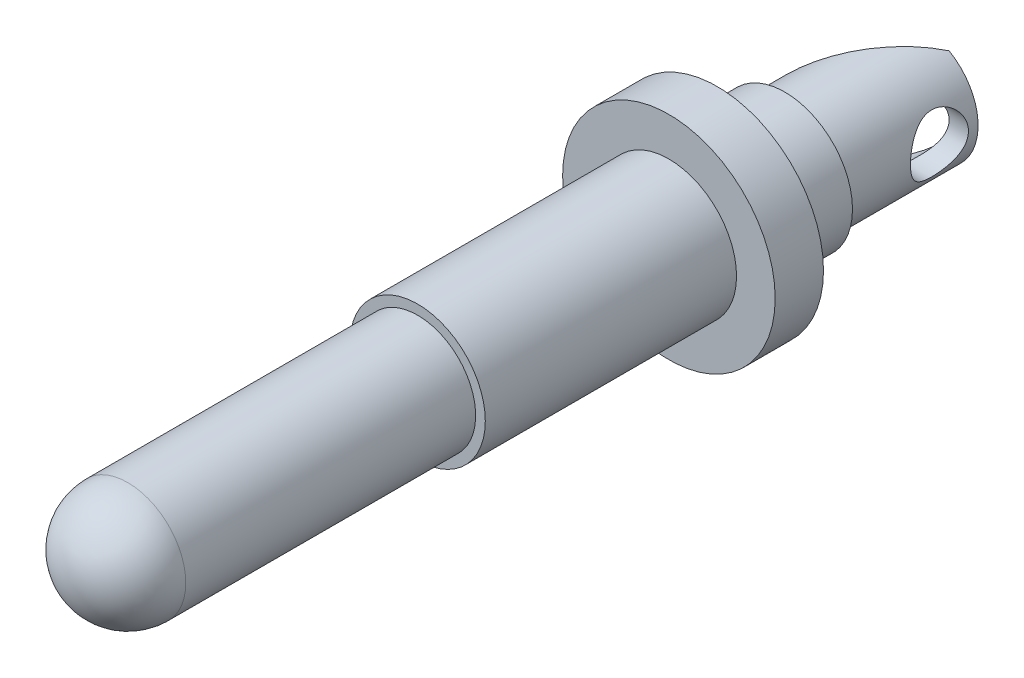
ISO-10303-21;
HEADER;
FILE_DESCRIPTION(('STEP AP214'),'2;1');
FILE_NAME('part.step','',(''),(''),'','','');
FILE_SCHEMA(('AUTOMOTIVE_DESIGN { 1 0 10303 214 1 1 1 1 }'));
ENDSEC;
DATA;
#1=APPLICATION_CONTEXT('core data for automotive mechanical design processes');
#2=APPLICATION_PROTOCOL_DEFINITION('international standard','automotive_design',2000,#1);
#3=PRODUCT_CONTEXT('',#1,'mechanical');
#4=PRODUCT('Part','Part','',(#3));
#5=PRODUCT_RELATED_PRODUCT_CATEGORY('part','',(#4));
#6=PRODUCT_DEFINITION_FORMATION('','',#4);
#7=PRODUCT_DEFINITION_CONTEXT('part definition',#1,'design');
#8=PRODUCT_DEFINITION('design','',#6,#7);
#9=PRODUCT_DEFINITION_SHAPE('','',#8);
#10=(LENGTH_UNIT() NAMED_UNIT(*) SI_UNIT(.MILLI.,.METRE.));
#11=(NAMED_UNIT(*) PLANE_ANGLE_UNIT() SI_UNIT($,.RADIAN.));
#12=(NAMED_UNIT(*) SI_UNIT($,.STERADIAN.) SOLID_ANGLE_UNIT());
#13=UNCERTAINTY_MEASURE_WITH_UNIT(LENGTH_MEASURE(1.E-05),#10,'distance_accuracy_value','');
#14=(GEOMETRIC_REPRESENTATION_CONTEXT(3) GLOBAL_UNCERTAINTY_ASSIGNED_CONTEXT((#13)) GLOBAL_UNIT_ASSIGNED_CONTEXT((#10,
#11,#12)) REPRESENTATION_CONTEXT('',''));
#15=CARTESIAN_POINT('',(0.,0.,0.));
#16=DIRECTION('',(0.,0.,1.));
#17=DIRECTION('',(1.,0.,0.));
#18=AXIS2_PLACEMENT_3D('',#15,#16,#17);
#19=CARTESIAN_POINT('',(0.,0.,-26.));
#20=DIRECTION('',(0.,0.,1.));
#21=DIRECTION('',(1.,0.,0.));
#22=AXIS2_PLACEMENT_3D('',#19,#20,#21);
#23=CYLINDRICAL_SURFACE('',#22,3.5);
#24=CARTESIAN_POINT('',(0.,0.,-19.));
#25=DIRECTION('',(0.,0.,-1.));
#26=DIRECTION('',(-1.,0.,0.));
#27=AXIS2_PLACEMENT_3D('',#24,#25,#26);
#28=CIRCLE('',#27,3.5);
#29=CARTESIAN_POINT('',(3.5,0.,-19.));
#30=VERTEX_POINT('',#29);
#31=EDGE_CURVE('E81',#30,#30,#28,.T.);
#32=CARTESIAN_POINT('',(0.,0.,-15.5));
#33=DIRECTION('',(0.,0.,1.));
#34=DIRECTION('',(1.,0.,0.));
#35=AXIS2_PLACEMENT_3D('',#32,#33,#34);
#36=CIRCLE('',#35,3.5);
#37=CARTESIAN_POINT('',(3.5,0.,-15.5));
#38=VERTEX_POINT('',#37);
#39=EDGE_CURVE('E42',#38,#38,#36,.T.);
#40=CARTESIAN_POINT('',(3.5,0.,-19.));
#41=CARTESIAN_POINT('',(3.5,0.,-18.9635416666667));
#42=CARTESIAN_POINT('',(3.5,0.,-18.9270833333333));
#43=CARTESIAN_POINT('',(3.5,0.,-18.8541666666667));
#44=CARTESIAN_POINT('',(3.5,0.,-18.8177083333333));
#45=CARTESIAN_POINT('',(3.5,0.,-18.7447916666667));
#46=CARTESIAN_POINT('',(3.5,0.,-18.7083333333333));
#47=CARTESIAN_POINT('',(3.5,0.,-18.6354166666667));
#48=CARTESIAN_POINT('',(3.5,0.,-18.5989583333333));
#49=CARTESIAN_POINT('',(3.5,0.,-18.5260416666667));
#50=CARTESIAN_POINT('',(3.5,0.,-18.4895833333333));
#51=CARTESIAN_POINT('',(3.5,0.,-18.4166666666667));
#52=CARTESIAN_POINT('',(3.5,0.,-18.3802083333333));
#53=CARTESIAN_POINT('',(3.5,0.,-18.3072916666667));
#54=CARTESIAN_POINT('',(3.5,0.,-18.2708333333333));
#55=CARTESIAN_POINT('',(3.5,0.,-18.1979166666667));
#56=CARTESIAN_POINT('',(3.5,0.,-18.1614583333333));
#57=CARTESIAN_POINT('',(3.5,0.,-18.0885416666667));
#58=CARTESIAN_POINT('',(3.5,0.,-18.0520833333333));
#59=CARTESIAN_POINT('',(3.5,0.,-17.9791666666667));
#60=CARTESIAN_POINT('',(3.5,0.,-17.9427083333333));
#61=CARTESIAN_POINT('',(3.5,0.,-17.8697916666667));
#62=CARTESIAN_POINT('',(3.5,0.,-17.8333333333333));
#63=CARTESIAN_POINT('',(3.5,0.,-17.7604166666667));
#64=CARTESIAN_POINT('',(3.5,0.,-17.7239583333333));
#65=CARTESIAN_POINT('',(3.5,0.,-17.6510416666667));
#66=CARTESIAN_POINT('',(3.5,0.,-17.6145833333333));
#67=CARTESIAN_POINT('',(3.5,0.,-17.5416666666667));
#68=CARTESIAN_POINT('',(3.5,0.,-17.5052083333333));
#69=CARTESIAN_POINT('',(3.5,0.,-17.4322916666667));
#70=CARTESIAN_POINT('',(3.5,0.,-17.3958333333333));
#71=CARTESIAN_POINT('',(3.5,0.,-17.3229166666667));
#72=CARTESIAN_POINT('',(3.5,0.,-17.2864583333333));
#73=CARTESIAN_POINT('',(3.5,0.,-17.2135416666667));
#74=CARTESIAN_POINT('',(3.5,0.,-17.1770833333333));
#75=CARTESIAN_POINT('',(3.5,0.,-17.1041666666667));
#76=CARTESIAN_POINT('',(3.5,0.,-17.0677083333333));
#77=CARTESIAN_POINT('',(3.5,0.,-16.9947916666667));
#78=CARTESIAN_POINT('',(3.5,0.,-16.9583333333333));
#79=CARTESIAN_POINT('',(3.5,0.,-16.8854166666667));
#80=CARTESIAN_POINT('',(3.5,0.,-16.8489583333333));
#81=CARTESIAN_POINT('',(3.5,0.,-16.7760416666667));
#82=CARTESIAN_POINT('',(3.5,0.,-16.7395833333333));
#83=CARTESIAN_POINT('',(3.5,0.,-16.6666666666667));
#84=CARTESIAN_POINT('',(3.5,0.,-16.6302083333333));
#85=CARTESIAN_POINT('',(3.5,0.,-16.5572916666667));
#86=CARTESIAN_POINT('',(3.5,0.,-16.5208333333333));
#87=CARTESIAN_POINT('',(3.5,0.,-16.4479166666667));
#88=CARTESIAN_POINT('',(3.5,0.,-16.4114583333333));
#89=CARTESIAN_POINT('',(3.5,0.,-16.3385416666667));
#90=CARTESIAN_POINT('',(3.5,0.,-16.3020833333333));
#91=CARTESIAN_POINT('',(3.5,0.,-16.2291666666667));
#92=CARTESIAN_POINT('',(3.5,0.,-16.1927083333333));
#93=CARTESIAN_POINT('',(3.5,0.,-16.1197916666667));
#94=CARTESIAN_POINT('',(3.5,0.,-16.0833333333333));
#95=CARTESIAN_POINT('',(3.5,0.,-16.0104166666667));
#96=CARTESIAN_POINT('',(3.5,0.,-15.9739583333333));
#97=CARTESIAN_POINT('',(3.5,0.,-15.9010416666667));
#98=CARTESIAN_POINT('',(3.5,0.,-15.8645833333333));
#99=CARTESIAN_POINT('',(3.5,0.,-15.7916666666667));
#100=CARTESIAN_POINT('',(3.5,0.,-15.7552083333333));
#101=CARTESIAN_POINT('',(3.5,0.,-15.6822916666667));
#102=CARTESIAN_POINT('',(3.5,0.,-15.6458333333333));
#103=CARTESIAN_POINT('',(3.5,0.,-15.5729166666667));
#104=CARTESIAN_POINT('',(3.5,0.,-15.5364583333333));
#105=CARTESIAN_POINT('',(3.5,0.,-15.5));
#106=B_SPLINE_CURVE_WITH_KNOTS('',3,(#40,#41,#42,#43,#44,#45,#46,#47,#48,#49,#50,#51,#52,#53,
#54,#55,#56,#57,#58,#59,#60,#61,#62,#63,#64,#65,#66,#67,#68,#69,#70,#71,#72,#73,#74,#75,#76,#77,
#78,#79,#80,#81,#82,#83,#84,#85,#86,#87,#88,#89,#90,#91,#92,#93,#94,#95,#96,#97,#98,#99,#100,
#101,#102,#103,#104,#105),.UNSPECIFIED.,.F.,.F.,(4,2,2,2,2,2,2,2,2,2,2,2,2,2,2,2,2,2,2,2,2,2,2,
2,2,2,2,2,2,2,2,2,4),(0.,0.109375000000002,0.21875,0.328125000000002,0.4375,0.546874999999999,
0.656250000000001,0.765625000000002,0.874999999999997,0.984374999999999,1.09375,1.203125,1.3125,
1.421875,1.53125,1.640625,1.75,1.859375,1.96875,2.078125,2.1875,2.296875,2.40625,2.515625,2.625,
2.734375,2.84375,2.953125,3.0625,3.171875,3.28125,3.390625,3.5),.UNSPECIFIED.);
#107=EDGE_CURVE('BSEAM34',#30,#38,#106,.T.);
#108=ORIENTED_EDGE('',*,*,#31,.F.);
#109=ORIENTED_EDGE('',*,*,#39,.F.);
#110=ORIENTED_EDGE('',*,*,#107,.T.);
#111=ORIENTED_EDGE('',*,*,#107,.F.);
#112=EDGE_LOOP('',(#108,#110,#109,#111));
#113=FACE_BOUND('',#112,.T.);
#114=ADVANCED_FACE('F34',(#113),#23,.T.);
#115=CARTESIAN_POINT('',(0.,0.,-19.));
#116=DIRECTION('',(0.,0.,-1.));
#117=DIRECTION('',(-1.,0.,0.));
#118=AXIS2_PLACEMENT_3D('',#115,#116,#117);
#119=PLANE('',#118);
#120=CARTESIAN_POINT('',(0.,0.,-19.));
#121=DIRECTION('',(0.,0.,-1.));
#122=DIRECTION('',(-1.,0.,0.));
#123=AXIS2_PLACEMENT_3D('',#120,#121,#122);
#124=CIRCLE('',#123,3.);
#125=CARTESIAN_POINT('',(-3.,0.,-19.));
#126=VERTEX_POINT('',#125);
#127=EDGE_CURVE('E77',#126,#126,#124,.T.);
#128=ORIENTED_EDGE('',*,*,#127,.F.);
#129=EDGE_LOOP('',(#128));
#130=FACE_BOUND('',#129,.T.);
#131=ORIENTED_EDGE('',*,*,#31,.T.);
#132=EDGE_LOOP('',(#131));
#133=FACE_BOUND('',#132,.T.);
#134=ADVANCED_FACE('F151',(#130,#133),#119,.T.);
#135=CARTESIAN_POINT('',(0.,0.,-19.));
#136=DIRECTION('',(0.,0.,-1.));
#137=DIRECTION('',(-1.,0.,0.));
#138=AXIS2_PLACEMENT_3D('',#135,#136,#137);
#139=CYLINDRICAL_SURFACE('',#138,3.);
#140=CARTESIAN_POINT('',(0.,0.,-24.));
#141=DIRECTION('',(0.8,0.,0.6));
#142=DIRECTION('',(0.6,0.,-0.8));
#143=AXIS2_PLACEMENT_3D('',#140,#141,#142);
#144=ELLIPSE('',#143,5.,3.);
#145=CARTESIAN_POINT('',(1.5,-2.59807621135332,-26.));
#146=VERTEX_POINT('',#145);
#147=CARTESIAN_POINT('',(1.5,2.59807621135332,-26.));
#148=VERTEX_POINT('',#147);
#149=EDGE_CURVE('E63',#146,#148,#144,.F.);
#150=ORIENTED_EDGE('',*,*,#149,.F.);
#151=CARTESIAN_POINT('',(0.,0.,-26.));
#152=DIRECTION('',(0.,0.,-1.));
#153=DIRECTION('',(-1.,0.,0.));
#154=AXIS2_PLACEMENT_3D('',#151,#152,#153);
#155=CIRCLE('',#154,3.);
#156=EDGE_CURVE('E73',#148,#146,#155,.T.);
#157=ORIENTED_EDGE('',*,*,#156,.F.);
#158=EDGE_LOOP('',(#150,#157));
#159=FACE_BOUND('',#158,.T.);
#160=CARTESIAN_POINT('',(3.,0.,-22.5));
#161=CARTESIAN_POINT('',(2.99999570107562,-0.0788579444268496,-22.5000049534758));
#162=CARTESIAN_POINT('',(2.99685736529635,-0.157809899546343,-22.5062551096816));
#163=CARTESIAN_POINT('',(2.98461234055736,-0.313380352903342,-22.5309793205123));
#164=CARTESIAN_POINT('',(2.97549431743379,-0.389994130070442,-22.5494765894967));
#165=CARTESIAN_POINT('',(2.95224419105063,-0.538400317320669,-22.597790712925));
#166=CARTESIAN_POINT('',(2.93813158766306,-0.610210204408714,-22.627563576372));
#167=CARTESIAN_POINT('',(2.90618664773642,-0.747708925209891,-22.6973559320475));
#168=CARTESIAN_POINT('',(2.88835460450288,-0.813398240985082,-22.7373746163733));
#169=CARTESIAN_POINT('',(2.84934387387093,-0.941261726642856,-22.8292758742279));
#170=CARTESIAN_POINT('',(2.82802798691306,-1.00298281668316,-22.8817297188595));
#171=CARTESIAN_POINT('',(2.78489955370115,-1.11716916730046,-22.9957822188706));
#172=CARTESIAN_POINT('',(2.76308664313552,-1.16962737466014,-23.0573877776587));
#173=CARTESIAN_POINT('',(2.71948426796022,-1.26787800067541,-23.1937250242851));
#174=CARTESIAN_POINT('',(2.69782780455198,-1.31283800332745,-23.2691041475189));
#175=CARTESIAN_POINT('',(2.65928968158481,-1.38925234033603,-23.4275510039793));
#176=CARTESIAN_POINT('',(2.64240461410485,-1.42071632244949,-23.5106131930841));
#177=CARTESIAN_POINT('',(2.61686800556713,-1.46719866328287,-23.6769976581329));
#178=CARTESIAN_POINT('',(2.60778407375571,-1.48308878562065,-23.7600066781011));
#179=CARTESIAN_POINT('',(2.59772834922792,-1.50064048996326,-23.9279682566692));
#180=CARTESIAN_POINT('',(2.59674854014933,-1.5023161325596,-24.0129188113067));
#181=CARTESIAN_POINT('',(2.60266395385873,-1.49203093075843,-24.1714290364731));
#182=CARTESIAN_POINT('',(2.60863145493021,-1.48167683930522,-24.2451360468346));
#183=CARTESIAN_POINT('',(2.62614343100776,-1.45040977358539,-24.3895828640596));
#184=CARTESIAN_POINT('',(2.63768968247665,-1.42949343584647,-24.460321717958));
#185=CARTESIAN_POINT('',(2.66531214619112,-1.37731467057899,-24.5988436988485));
#186=CARTESIAN_POINT('',(2.68148760995998,-1.34582260067398,-24.6665195981787));
#187=CARTESIAN_POINT('',(2.71655106422106,-1.27356253150199,-24.795951438885));
#188=CARTESIAN_POINT('',(2.73544027170286,-1.23279036571869,-24.8577047034001));
#189=CARTESIAN_POINT('',(2.77669736854929,-1.13709908236917,-24.9817818791148));
#190=CARTESIAN_POINT('',(2.7992026535512,-1.08104168755391,-25.0431853103642));
#191=CARTESIAN_POINT('',(2.84321434950611,-0.95933336811205,-25.1561031278863));
#192=CARTESIAN_POINT('',(2.86472027938202,-0.893677884861418,-25.2076127880508));
#193=CARTESIAN_POINT('',(2.90552980924446,-0.750774758747763,-25.3015284915446));
#194=CARTESIAN_POINT('',(2.92468476243011,-0.673130387399105,-25.3434007086686));
#195=CARTESIAN_POINT('',(2.95736821681864,-0.510699323233188,-25.4131455435645));
#196=CARTESIAN_POINT('',(2.9709011841533,-0.425918364397907,-25.4410292775227));
#197=CARTESIAN_POINT('',(2.98986500612153,-0.259149737491048,-25.479713105575));
#198=CARTESIAN_POINT('',(2.99587407451965,-0.177512295822485,-25.4917368536202));
#199=CARTESIAN_POINT('',(3.00109520188655,-0.0131693999240255,-25.5021970967017));
#200=CARTESIAN_POINT('',(3.00031048081978,0.0695355298048641,-25.5006400284592));
#201=CARTESIAN_POINT('',(2.99236788380152,0.22684945797898,-25.4846899673719));
#202=CARTESIAN_POINT('',(2.98570868532253,0.301589112074895,-25.471301200905));
#203=CARTESIAN_POINT('',(2.9673325697226,0.447610338452911,-25.4336428921573));
#204=CARTESIAN_POINT('',(2.95561509501618,0.518891528536629,-25.4093721503198));
#205=CARTESIAN_POINT('',(2.92776377120382,0.658332912674356,-25.3500023003504));
#206=CARTESIAN_POINT('',(2.91151322654446,0.726345595508702,-25.3146134248256));
#207=CARTESIAN_POINT('',(2.87615961476127,0.855692042548903,-25.2343386965301));
#208=CARTESIAN_POINT('',(2.85705533350408,0.917022944664883,-25.1894487981069));
#209=CARTESIAN_POINT('',(2.81562332004297,1.03765153393382,-25.0863593620039));
#210=CARTESIAN_POINT('',(2.79316327265249,1.09615811672853,-25.0272856973323));
#211=CARTESIAN_POINT('',(2.7489358741323,1.20278448167828,-24.9001122730834));
#212=CARTESIAN_POINT('',(2.72716901100071,1.2508970785678,-24.8320063217281));
#213=CARTESIAN_POINT('',(2.68576788309735,1.33756187171852,-24.6845345187405));
#214=CARTESIAN_POINT('',(2.66628794383592,1.37553824370036,-24.6047831008583));
#215=CARTESIAN_POINT('',(2.63361108441203,1.43712423890204,-24.4387348986375));
#216=CARTESIAN_POINT('',(2.62040607332626,1.46075237380051,-24.3524467102997));
#217=CARTESIAN_POINT('',(2.60342251538704,1.4907925312003,-24.1846346656729));
#218=CARTESIAN_POINT('',(2.59886075197598,1.49863949460817,-24.1034486198471));
#219=CARTESIAN_POINT('',(2.59748031962406,1.50103373156429,-23.9408293992532));
#220=CARTESIAN_POINT('',(2.60065829439586,1.49558676993485,-23.8593963468932));
#221=CARTESIAN_POINT('',(2.61356793076616,1.47288918838995,-23.7067747476998));
#222=CARTESIAN_POINT('',(2.62264641723988,1.45681247151454,-23.6353492947829));
#223=CARTESIAN_POINT('',(2.6455652428148,1.41476303733661,-23.4962878208635));
#224=CARTESIAN_POINT('',(2.65940711354503,1.38878713673987,-23.428653026862));
#225=CARTESIAN_POINT('',(2.69142795546804,1.32572361795083,-23.2940627235202));
#226=CARTESIAN_POINT('',(2.70983583593882,1.28800670672354,-23.2274581472565));
#227=CARTESIAN_POINT('',(2.74852997452291,1.20322645745608,-23.1010881957281));
#228=CARTESIAN_POINT('',(2.76881720693417,1.15615825686233,-23.0413264042183));
#229=CARTESIAN_POINT('',(2.81193484737139,1.04730498999205,-22.922787026468));
#230=CARTESIAN_POINT('',(2.83477474959943,0.98442663449588,-22.8650113464746));
#231=CARTESIAN_POINT('',(2.87816628389896,0.849232209349785,-22.7606055248471));
#232=CARTESIAN_POINT('',(2.89871667939293,0.776911084957785,-22.7139813907951));
#233=CARTESIAN_POINT('',(2.93547014349806,0.623897395174408,-22.6331454559319));
#234=CARTESIAN_POINT('',(2.951641447409,0.543149255665086,-22.5990237461453));
#235=CARTESIAN_POINT('',(2.9775201194848,0.376113151707122,-22.5452877483639));
#236=CARTESIAN_POINT('',(2.98724585044602,0.289841699383643,-22.5256322297914));
#237=CARTESIAN_POINT('',(2.99543192870217,0.168902919736338,-22.5091538833714));
#238=CARTESIAN_POINT('',(2.99714048010376,0.135242819162344,-22.5057260387005));
#239=CARTESIAN_POINT('',(2.99942545465223,0.0677275977076359,-22.5011480017289));
#240=CARTESIAN_POINT('',(3.00000184655071,0.0338724714699419,-22.4999978722947));
#241=CARTESIAN_POINT('',(3.,0.,-22.5));
#242=B_SPLINE_CURVE_WITH_KNOTS('',3,(#160,#161,#162,#163,#164,#165,#166,#167,#168,#169,#170,
#171,#172,#173,#174,#175,#176,#177,#178,#179,#180,#181,#182,#183,#184,#185,#186,#187,#188,#189,
#190,#191,#192,#193,#194,#195,#196,#197,#198,#199,#200,#201,#202,#203,#204,#205,#206,#207,#208,
#209,#210,#211,#212,#213,#214,#215,#216,#217,#218,#219,#220,#221,#222,#223,#224,#225,#226,#227,
#228,#229,#230,#231,#232,#233,#234,#235,#236,#237,#238,#239,#240,#241),.UNSPECIFIED.,.T.,.F.,(4,
2,2,2,2,2,2,2,2,2,2,2,2,2,2,2,2,2,2,2,2,2,2,2,2,2,2,2,2,2,2,2,2,2,2,2,2,2,2,2,4),(0.,
0.236436386130437,0.473322224563792,0.709293233238441,0.945245640872344,1.19547263807712,
1.44588935648104,1.71572589646128,1.9853692184742,2.23887018210342,2.49212035993529,
2.71508568613978,2.93812205888515,3.16635360252728,3.3946878189033,3.65197412000815,
3.90938301898026,4.17874533321658,4.44789325368416,4.69474935707015,4.9414884676721,
5.16910359759179,5.39674382446393,5.63089284041843,5.86514176122504,6.12239415966623,
6.37982382923142,6.64972023242583,6.91926767918171,7.16293961254564,7.40650589797011,
7.62686895373277,7.8473029318252,8.08254685170425,8.3179134171544,8.58187864135751,
8.84598575071862,9.11196020495283,9.37717362931716,9.47872920200867,9.58028757766591),.UNSPECIFIED.);
#243=CARTESIAN_POINT('',(3.,0.,-22.5));
#244=VERTEX_POINT('',#243);
#245=EDGE_CURVE('E74',#244,#244,#242,.T.);
#246=ORIENTED_EDGE('',*,*,#245,.F.);
#247=EDGE_LOOP('',(#246));
#248=FACE_BOUND('',#247,.T.);
#249=ORIENTED_EDGE('',*,*,#127,.T.);
#250=EDGE_LOOP('',(#249));
#251=FACE_BOUND('',#250,.T.);
#252=ADVANCED_FACE('F71',(#159,#248,#251),#139,.T.);
#253=CARTESIAN_POINT('',(0.,0.,-26.));
#254=DIRECTION('',(0.,0.,-1.));
#255=DIRECTION('',(-1.,0.,0.));
#256=AXIS2_PLACEMENT_3D('',#253,#254,#255);
#257=PLANE('',#256);
#258=DIRECTION('',(0.,1.,0.));
#259=VECTOR('',#258,1.);
#260=CARTESIAN_POINT('',(1.5,-5.5,-26.));
#261=LINE('',#260,#259);
#262=CARTESIAN_POINT('',(1.5,1.32287565553229,-26.));
#263=VERTEX_POINT('',#262);
#264=EDGE_CURVE('E49',#263,#148,#261,.T.);
#265=ORIENTED_EDGE('',*,*,#264,.T.);
#266=ORIENTED_EDGE('',*,*,#156,.T.);
#267=CARTESIAN_POINT('',(1.5,-1.32287565553229,-26.));
#268=VERTEX_POINT('',#267);
#269=EDGE_CURVE('E60',#146,#268,#261,.T.);
#270=ORIENTED_EDGE('',*,*,#269,.T.);
#271=CARTESIAN_POINT('',(0.,0.,-26.));
#272=DIRECTION('',(0.,0.,-1.));
#273=DIRECTION('',(-1.,0.,0.));
#274=AXIS2_PLACEMENT_3D('',#271,#272,#273);
#275=CIRCLE('',#274,2.);
#276=EDGE_CURVE('E126',#263,#268,#275,.T.);
#277=ORIENTED_EDGE('',*,*,#276,.F.);
#278=EDGE_LOOP('',(#265,#266,#270,#277));
#279=FACE_BOUND('',#278,.T.);
#280=ADVANCED_FACE('F76',(#279),#257,.T.);
#281=CARTESIAN_POINT('',(0.,0.,-15.5));
#282=DIRECTION('',(0.,0.,1.));
#283=DIRECTION('',(1.,0.,0.));
#284=AXIS2_PLACEMENT_3D('',#281,#282,#283);
#285=PLANE('',#284);
#286=CARTESIAN_POINT('',(0.,0.,-15.5));
#287=DIRECTION('',(0.,0.,1.));
#288=DIRECTION('',(1.,0.,0.));
#289=AXIS2_PLACEMENT_3D('',#286,#287,#288);
#290=CIRCLE('',#289,5.5);
#291=CARTESIAN_POINT('',(5.5,0.,-15.5));
#292=VERTEX_POINT('',#291);
#293=EDGE_CURVE('E84',#292,#292,#290,.T.);
#294=ORIENTED_EDGE('',*,*,#293,.F.);
#295=EDGE_LOOP('',(#294));
#296=FACE_BOUND('',#295,.T.);
#297=ORIENTED_EDGE('',*,*,#39,.T.);
#298=EDGE_LOOP('',(#297));
#299=FACE_BOUND('',#298,.T.);
#300=ADVANCED_FACE('F148',(#296,#299),#285,.F.);
#301=CARTESIAN_POINT('',(0.,0.,-13.));
#302=DIRECTION('',(0.,0.,1.));
#303=DIRECTION('',(1.,0.,0.));
#304=AXIS2_PLACEMENT_3D('',#301,#302,#303);
#305=PLANE('',#304);
#306=CARTESIAN_POINT('',(0.,0.,-13.));
#307=DIRECTION('',(0.,0.,1.));
#308=DIRECTION('',(1.,0.,0.));
#309=AXIS2_PLACEMENT_3D('',#306,#307,#308);
#310=CIRCLE('',#309,5.5);
#311=CARTESIAN_POINT('',(5.5,0.,-13.));
#312=VERTEX_POINT('',#311);
#313=EDGE_CURVE('E131',#312,#312,#310,.T.);
#314=ORIENTED_EDGE('',*,*,#313,.T.);
#315=EDGE_LOOP('',(#314));
#316=FACE_BOUND('',#315,.T.);
#317=CARTESIAN_POINT('',(0.,0.,-13.));
#318=DIRECTION('',(0.,0.,1.));
#319=DIRECTION('',(1.,0.,0.));
#320=AXIS2_PLACEMENT_3D('',#317,#318,#319);
#321=CIRCLE('',#320,3.5);
#322=CARTESIAN_POINT('',(3.5,0.,-13.));
#323=VERTEX_POINT('',#322);
#324=EDGE_CURVE('E78',#323,#323,#321,.T.);
#325=ORIENTED_EDGE('',*,*,#324,.F.);
#326=EDGE_LOOP('',(#325));
#327=FACE_BOUND('',#326,.T.);
#328=ADVANCED_FACE('F136',(#316,#327),#305,.T.);
#329=CARTESIAN_POINT('',(0.,0.,-15.5));
#330=DIRECTION('',(0.,0.,1.));
#331=DIRECTION('',(1.,0.,0.));
#332=AXIS2_PLACEMENT_3D('',#329,#330,#331);
#333=CYLINDRICAL_SURFACE('',#332,5.5);
#334=ORIENTED_EDGE('',*,*,#293,.T.);
#335=EDGE_LOOP('',(#334));
#336=FACE_BOUND('',#335,.T.);
#337=ORIENTED_EDGE('',*,*,#313,.F.);
#338=EDGE_LOOP('',(#337));
#339=FACE_BOUND('',#338,.T.);
#340=ADVANCED_FACE('F139',(#336,#339),#333,.T.);
#341=CARTESIAN_POINT('',(0.,0.,15.));
#342=DIRECTION('',(0.,0.,1.));
#343=DIRECTION('',(1.,0.,0.));
#344=AXIS2_PLACEMENT_3D('',#341,#342,#343);
#345=SPHERICAL_SURFACE('',#344,3.);
#346=CARTESIAN_POINT('',(0.,0.,15.));
#347=DIRECTION('',(0.,0.,1.));
#348=DIRECTION('',(1.,0.,0.));
#349=AXIS2_PLACEMENT_3D('',#346,#347,#348);
#350=CIRCLE('',#349,3.);
#351=CARTESIAN_POINT('',(3.,0.,15.));
#352=VERTEX_POINT('',#351);
#353=EDGE_CURVE('E96',#352,#352,#350,.T.);
#354=ORIENTED_EDGE('',*,*,#353,.T.);
#355=EDGE_LOOP('',(#354));
#356=FACE_BOUND('',#355,.T.);
#357=ADVANCED_FACE('F36',(#356),#345,.T.);
#358=CARTESIAN_POINT('',(0.,0.,15.));
#359=DIRECTION('',(0.,0.,-1.));
#360=DIRECTION('',(-1.,0.,0.));
#361=AXIS2_PLACEMENT_3D('',#358,#359,#360);
#362=CYLINDRICAL_SURFACE('',#361,3.);
#363=ORIENTED_EDGE('',*,*,#353,.F.);
#364=EDGE_LOOP('',(#363));
#365=FACE_BOUND('',#364,.T.);
#366=CARTESIAN_POINT('',(0.,0.,0.));
#367=DIRECTION('',(0.,0.,-1.));
#368=DIRECTION('',(-1.,0.,0.));
#369=AXIS2_PLACEMENT_3D('',#366,#367,#368);
#370=CIRCLE('',#369,3.);
#371=CARTESIAN_POINT('',(-3.,0.,0.));
#372=VERTEX_POINT('',#371);
#373=EDGE_CURVE('E93',#372,#372,#370,.T.);
#374=ORIENTED_EDGE('',*,*,#373,.F.);
#375=EDGE_LOOP('',(#374));
#376=FACE_BOUND('',#375,.T.);
#377=ADVANCED_FACE('F146',(#365,#376),#362,.T.);
#378=CARTESIAN_POINT('',(0.,0.,0.));
#379=DIRECTION('',(0.,0.,-1.));
#380=DIRECTION('',(-1.,0.,0.));
#381=AXIS2_PLACEMENT_3D('',#378,#379,#380);
#382=PLANE('',#381);
#383=CARTESIAN_POINT('',(0.,0.,0.));
#384=DIRECTION('',(0.,0.,-1.));
#385=DIRECTION('',(-1.,0.,0.));
#386=AXIS2_PLACEMENT_3D('',#383,#384,#385);
#387=CIRCLE('',#386,3.5);
#388=CARTESIAN_POINT('',(3.5,0.,0.));
#389=VERTEX_POINT('',#388);
#390=EDGE_CURVE('E90',#389,#389,#387,.T.);
#391=ORIENTED_EDGE('',*,*,#390,.F.);
#392=EDGE_LOOP('',(#391));
#393=FACE_BOUND('',#392,.T.);
#394=ORIENTED_EDGE('',*,*,#373,.T.);
#395=EDGE_LOOP('',(#394));
#396=FACE_BOUND('',#395,.T.);
#397=ADVANCED_FACE('F164',(#393,#396),#382,.F.);
#398=CARTESIAN_POINT('',(3.5,0.,-13.));
#399=CARTESIAN_POINT('',(3.5,0.,-12.8645833333333));
#400=CARTESIAN_POINT('',(3.5,0.,-12.7291666666667));
#401=CARTESIAN_POINT('',(3.5,0.,-12.4583333333333));
#402=CARTESIAN_POINT('',(3.5,0.,-12.3229166666667));
#403=CARTESIAN_POINT('',(3.5,0.,-12.0520833333333));
#404=CARTESIAN_POINT('',(3.5,0.,-11.9166666666667));
#405=CARTESIAN_POINT('',(3.5,0.,-11.6458333333333));
#406=CARTESIAN_POINT('',(3.5,0.,-11.5104166666667));
#407=CARTESIAN_POINT('',(3.5,0.,-11.2395833333333));
#408=CARTESIAN_POINT('',(3.5,0.,-11.1041666666667));
#409=CARTESIAN_POINT('',(3.5,0.,-10.8333333333333));
#410=CARTESIAN_POINT('',(3.5,0.,-10.6979166666667));
#411=CARTESIAN_POINT('',(3.5,0.,-10.4270833333333));
#412=CARTESIAN_POINT('',(3.5,0.,-10.2916666666667));
#413=CARTESIAN_POINT('',(3.5,0.,-10.0208333333333));
#414=CARTESIAN_POINT('',(3.5,0.,-9.88541666666667));
#415=CARTESIAN_POINT('',(3.5,0.,-9.61458333333333));
#416=CARTESIAN_POINT('',(3.5,0.,-9.47916666666667));
#417=CARTESIAN_POINT('',(3.5,0.,-9.20833333333333));
#418=CARTESIAN_POINT('',(3.5,0.,-9.07291666666667));
#419=CARTESIAN_POINT('',(3.5,0.,-8.80208333333333));
#420=CARTESIAN_POINT('',(3.5,0.,-8.66666666666667));
#421=CARTESIAN_POINT('',(3.5,0.,-8.39583333333333));
#422=CARTESIAN_POINT('',(3.5,0.,-8.26041666666667));
#423=CARTESIAN_POINT('',(3.5,0.,-7.98958333333333));
#424=CARTESIAN_POINT('',(3.5,0.,-7.85416666666667));
#425=CARTESIAN_POINT('',(3.5,0.,-7.58333333333333));
#426=CARTESIAN_POINT('',(3.5,0.,-7.44791666666667));
#427=CARTESIAN_POINT('',(3.5,0.,-7.17708333333333));
#428=CARTESIAN_POINT('',(3.5,0.,-7.04166666666667));
#429=CARTESIAN_POINT('',(3.5,0.,-6.77083333333333));
#430=CARTESIAN_POINT('',(3.5,0.,-6.63541666666667));
#431=CARTESIAN_POINT('',(3.5,0.,-6.36458333333333));
#432=CARTESIAN_POINT('',(3.5,0.,-6.22916666666667));
#433=CARTESIAN_POINT('',(3.5,0.,-5.95833333333334));
#434=CARTESIAN_POINT('',(3.5,0.,-5.82291666666667));
#435=CARTESIAN_POINT('',(3.5,0.,-5.55208333333333));
#436=CARTESIAN_POINT('',(3.5,0.,-5.41666666666667));
#437=CARTESIAN_POINT('',(3.5,0.,-5.14583333333333));
#438=CARTESIAN_POINT('',(3.5,0.,-5.01041666666667));
#439=CARTESIAN_POINT('',(3.5,0.,-4.73958333333333));
#440=CARTESIAN_POINT('',(3.5,0.,-4.60416666666667));
#441=CARTESIAN_POINT('',(3.5,0.,-4.33333333333333));
#442=CARTESIAN_POINT('',(3.5,0.,-4.19791666666667));
#443=CARTESIAN_POINT('',(3.5,0.,-3.92708333333333));
#444=CARTESIAN_POINT('',(3.5,0.,-3.79166666666667));
#445=CARTESIAN_POINT('',(3.5,0.,-3.52083333333333));
#446=CARTESIAN_POINT('',(3.5,0.,-3.38541666666667));
#447=CARTESIAN_POINT('',(3.5,0.,-3.11458333333333));
#448=CARTESIAN_POINT('',(3.5,0.,-2.97916666666667));
#449=CARTESIAN_POINT('',(3.5,0.,-2.70833333333333));
#450=CARTESIAN_POINT('',(3.5,0.,-2.57291666666667));
#451=CARTESIAN_POINT('',(3.5,0.,-2.30208333333333));
#452=CARTESIAN_POINT('',(3.5,0.,-2.16666666666667));
#453=CARTESIAN_POINT('',(3.5,0.,-1.89583333333333));
#454=CARTESIAN_POINT('',(3.5,0.,-1.76041666666667));
#455=CARTESIAN_POINT('',(3.5,0.,-1.48958333333333));
#456=CARTESIAN_POINT('',(3.5,0.,-1.35416666666667));
#457=CARTESIAN_POINT('',(3.5,0.,-1.08333333333333));
#458=CARTESIAN_POINT('',(3.5,0.,-0.947916666666666));
#459=CARTESIAN_POINT('',(3.5,0.,-0.677083333333334));
#460=CARTESIAN_POINT('',(3.5,0.,-0.541666666666667));
#461=CARTESIAN_POINT('',(3.5,0.,-0.270833333333334));
#462=CARTESIAN_POINT('',(3.5,0.,-0.135416666666667));
#463=CARTESIAN_POINT('',(3.5,0.,0.));
#464=B_SPLINE_CURVE_WITH_KNOTS('',3,(#398,#399,#400,#401,#402,#403,#404,#405,#406,#407,#408,
#409,#410,#411,#412,#413,#414,#415,#416,#417,#418,#419,#420,#421,#422,#423,#424,#425,#426,#427,
#428,#429,#430,#431,#432,#433,#434,#435,#436,#437,#438,#439,#440,#441,#442,#443,#444,#445,#446,
#447,#448,#449,#450,#451,#452,#453,#454,#455,#456,#457,#458,#459,#460,#461,#462,#463),
.UNSPECIFIED.,.F.,.F.,(4,2,2,2,2,2,2,2,2,2,2,2,2,2,2,2,2,2,2,2,2,2,2,2,2,2,2,2,2,2,2,2,4),(0.,
0.40625,0.812500000000001,1.21875,1.625,2.03125,2.4375,2.84375,3.25,3.65625,4.0625,4.46875,
4.875,5.28125,5.6875,6.09375,6.5,6.90625,7.3125,7.71875,8.125,8.53125,8.9375,9.34375,9.75,
10.15625,10.5625,10.96875,11.375,11.78125,12.1875,12.59375,13.),.UNSPECIFIED.);
#465=EDGE_CURVE('BSEAM154',#323,#389,#464,.T.);
#466=ORIENTED_EDGE('',*,*,#324,.T.);
#467=ORIENTED_EDGE('',*,*,#390,.T.);
#468=ORIENTED_EDGE('',*,*,#465,.T.);
#469=ORIENTED_EDGE('',*,*,#465,.F.);
#470=EDGE_LOOP('',(#466,#468,#467,#469));
#471=FACE_BOUND('',#470,.T.);
#472=ADVANCED_FACE('F154',(#471),#23,.T.);
#473=CARTESIAN_POINT('',(0.,0.,-18.5));
#474=DIRECTION('',(0.,0.,-1.));
#475=DIRECTION('',(-1.,0.,0.));
#476=AXIS2_PLACEMENT_3D('',#473,#474,#475);
#477=CONICAL_SURFACE('',#476,2.,1.02974425867665);
#478=CARTESIAN_POINT('',(0.,0.,-17.2982787619449));
#479=VERTEX_POINT('',#478);
#480=VERTEX_LOOP('',#479);
#481=FACE_BOUND('',#480,.T.);
#482=CARTESIAN_POINT('',(0.,0.,-18.5));
#483=DIRECTION('',(0.,0.,-1.));
#484=DIRECTION('',(-1.,0.,0.));
#485=AXIS2_PLACEMENT_3D('',#482,#483,#484);
#486=CIRCLE('',#485,2.);
#487=CARTESIAN_POINT('',(-2.,0.,-18.5));
#488=VERTEX_POINT('',#487);
#489=EDGE_CURVE('E128',#488,#488,#486,.T.);
#490=ORIENTED_EDGE('',*,*,#489,.T.);
#491=EDGE_LOOP('',(#490));
#492=FACE_BOUND('',#491,.T.);
#493=ADVANCED_FACE('F163',(#481,#492),#477,.F.);
#494=CARTESIAN_POINT('',(0.,0.,-26.));
#495=DIRECTION('',(0.,0.,-1.));
#496=DIRECTION('',(-1.,0.,0.));
#497=AXIS2_PLACEMENT_3D('',#494,#495,#496);
#498=CYLINDRICAL_SURFACE('',#497,2.);
#499=CARTESIAN_POINT('',(2.,0.,-22.5));
#500=CARTESIAN_POINT('',(1.99999540196395,-0.0732207358411537,-22.500004792012));
#501=CARTESIAN_POINT('',(1.99593645526274,-0.146561062021484,-22.5054050243745));
#502=CARTESIAN_POINT('',(1.98006607281083,-0.290936396286465,-22.5266670634102));
#503=CARTESIAN_POINT('',(1.96823514679854,-0.361965136229002,-22.5425551716501));
#504=CARTESIAN_POINT('',(1.9379567495606,-0.499234626631246,-22.5837129092838));
#505=CARTESIAN_POINT('',(1.91954951932009,-0.565501615403733,-22.6089255135692));
#506=CARTESIAN_POINT('',(1.87750556721694,-0.692422335520748,-22.6675423441872));
#507=CARTESIAN_POINT('',(1.85387037535483,-0.753077701796327,-22.7009441741935));
#508=CARTESIAN_POINT('',(1.80049544543983,-0.873465937590138,-22.7782630115908));
#509=CARTESIAN_POINT('',(1.7703930854844,-0.932593229272025,-22.8228673293341));
#510=CARTESIAN_POINT('',(1.70767017883378,-1.0430271676767,-22.9194958373612));
#511=CARTESIAN_POINT('',(1.67504578078609,-1.09432148272225,-22.9715314827998));
#512=CARTESIAN_POINT('',(1.60271123651991,-1.19837161436622,-23.0935829532784));
#513=CARTESIAN_POINT('',(1.56290854864639,-1.24930578421203,-23.1651036771217));
#514=CARTESIAN_POINT('',(1.48711444664135,-1.33861998176347,-23.3174510123666));
#515=CARTESIAN_POINT('',(1.45111786883676,-1.37701716983076,-23.3982646970003));
#516=CARTESIAN_POINT('',(1.39977155180179,-1.42880627811787,-23.5395028386762));
#517=CARTESIAN_POINT('',(1.38157751186734,-1.44625674456538,-23.5973906971284));
#518=CARTESIAN_POINT('',(1.35171594150686,-1.47420672564843,-23.7163927347849));
#519=CARTESIAN_POINT('',(1.34003347910833,-1.48472215355266,-23.7774991778748));
#520=CARTESIAN_POINT('',(1.32503759684554,-1.49812822141444,-23.9021825855308));
#521=CARTESIAN_POINT('',(1.32180026676598,-1.50094954854206,-23.9657768067241));
#522=CARTESIAN_POINT('',(1.32459531776069,-1.49848213241867,-24.0926149108816));
#523=CARTESIAN_POINT('',(1.33063102218115,-1.49319048157348,-24.1558586600874));
#524=CARTESIAN_POINT('',(1.3496762326252,-1.47597739291881,-24.2731913474258));
#525=CARTESIAN_POINT('',(1.36187157059872,-1.46482486380815,-24.3275363710462));
#526=CARTESIAN_POINT('',(1.39114192844941,-1.43705671120731,-24.4334388787209));
#527=CARTESIAN_POINT('',(1.4082216364077,-1.42043583681171,-24.4849936278236));
#528=CARTESIAN_POINT('',(1.45741769294308,-1.37033064172533,-24.6162563866342));
#529=CARTESIAN_POINT('',(1.49225649139234,-1.33280148493978,-24.6934004166435));
#530=CARTESIAN_POINT('',(1.56533298145197,-1.24618023314517,-24.8391965238691));
#531=CARTESIAN_POINT('',(1.60357878886111,-1.19706004255876,-24.9078273392547));
#532=CARTESIAN_POINT('',(1.68051672313146,-1.08651604102133,-25.0377533904037));
#533=CARTESIAN_POINT('',(1.71919586730241,-1.02481375526034,-25.0988206068815));
#534=CARTESIAN_POINT('',(1.79248037980974,-0.890422521709562,-25.2102636467812));
#535=CARTESIAN_POINT('',(1.82709348263761,-0.817755054293728,-25.2606599202304));
#536=CARTESIAN_POINT('',(1.88279726073644,-0.677902080454113,-25.3399807992403));
#537=CARTESIAN_POINT('',(1.90520770945009,-0.61253987018559,-25.3711845942158));
#538=CARTESIAN_POINT('',(1.94372904416948,-0.476352173202057,-25.4242248804639));
#539=CARTESIAN_POINT('',(1.95984387504352,-0.405530141063737,-25.4460672384993));
#540=CARTESIAN_POINT('',(1.9844558863599,-0.25967623248349,-25.4792533628864));
#541=CARTESIAN_POINT('',(1.99290592971749,-0.184621281405915,-25.4905321789386));
#542=CARTESIAN_POINT('',(2.00115883659445,-0.0332012397968913,-25.5015495973717));
#543=CARTESIAN_POINT('',(2.00096534845407,0.0431632843727479,-25.5012930686954));
#544=CARTESIAN_POINT('',(1.99242547175873,0.186804217329647,-25.4898891307268));
#545=CARTESIAN_POINT('',(1.98490086600401,0.254222327546154,-25.4798394631113));
#546=CARTESIAN_POINT('',(1.96351320201587,0.386110670609137,-25.4510262199921));
#547=CARTESIAN_POINT('',(1.94964879507261,0.45058027298728,-25.4322607903106));
#548=CARTESIAN_POINT('',(1.91599830683313,0.577416779689787,-25.3861124694069));
#549=CARTESIAN_POINT('',(1.89602050290193,0.639629172536156,-25.3584488185726));
#550=CARTESIAN_POINT('',(1.85166985411962,0.758518527043089,-25.2958275445744));
#551=CARTESIAN_POINT('',(1.82729640132067,0.815194721336418,-25.2608689123602));
#552=CARTESIAN_POINT('',(1.77119146886498,0.931511626319051,-25.1782167535894));
#553=CARTESIAN_POINT('',(1.73891095025036,0.990066762698715,-25.1293714605625));
#554=CARTESIAN_POINT('',(1.67238952874784,1.09871974855855,-25.0239912474116));
#555=CARTESIAN_POINT('',(1.63814438507394,1.14879830469578,-24.9674393003066));
#556=CARTESIAN_POINT('',(1.56369128291496,1.24877541075627,-24.8358501190388));
#557=CARTESIAN_POINT('',(1.523587185201,1.29683043648705,-24.7593424385077));
#558=CARTESIAN_POINT('',(1.4494059134845,1.37923235998283,-24.5966399220275));
#559=CARTESIAN_POINT('',(1.41531099570969,1.41362000515519,-24.5104748780914));
#560=CARTESIAN_POINT('',(1.37118877808583,1.45615734256767,-24.3645855511255));
#561=CARTESIAN_POINT('',(1.35695811824565,1.46931009512995,-24.3076088735976));
#562=CARTESIAN_POINT('',(1.33542056103011,1.48891522181906,-24.1912929530168));
#563=CARTESIAN_POINT('',(1.32809821220234,1.49538255199239,-24.1319592931977));
#564=CARTESIAN_POINT('',(1.3215760179221,1.50115320209063,-24.0121709201886));
#565=CARTESIAN_POINT('',(1.32241740684977,1.50042015325261,-23.9517120569904));
#566=CARTESIAN_POINT('',(1.33216448543668,1.49176883838217,-23.8319431612478));
#567=CARTESIAN_POINT('',(1.34108058157485,1.48384130024583,-23.7726347121027));
#568=CARTESIAN_POINT('',(1.36817348797774,1.45893841819721,-23.6440854285892));
#569=CARTESIAN_POINT('',(1.38794705950645,1.44036567954109,-23.5755028198672));
#570=CARTESIAN_POINT('',(1.43382963385412,1.39469627266116,-23.4434651511695));
#571=CARTESIAN_POINT('',(1.45995460146932,1.36757807297727,-23.3800235579618));
#572=CARTESIAN_POINT('',(1.52516477328826,1.29498918933639,-23.2374793695136));
#573=CARTESIAN_POINT('',(1.56560203191107,1.24641542065967,-23.1605784172442));
#574=CARTESIAN_POINT('',(1.64713510181275,1.13650718465932,-23.0168739550224));
#575=CARTESIAN_POINT('',(1.68823146954225,1.07516134758573,-22.9500795340551));
#576=CARTESIAN_POINT('',(1.76728988939796,0.939627144937847,-22.8271681577166));
#577=CARTESIAN_POINT('',(1.80522333711074,0.865337161562814,-22.7711436806228));
#578=CARTESIAN_POINT('',(1.87357289668098,0.705159098936154,-22.6727769488546));
#579=CARTESIAN_POINT('',(1.9040069159296,0.619299420401743,-22.6304020254275));
#580=CARTESIAN_POINT('',(1.94636704624049,0.464840290356401,-22.5722005790143));
#581=CARTESIAN_POINT('',(1.96110322499719,0.398553614774679,-22.5522332686238));
#582=CARTESIAN_POINT('',(1.98383739970238,0.262841610392707,-22.5215820973885));
#583=CARTESIAN_POINT('',(1.99185421210894,0.193425623834854,-22.51087230975));
#584=CARTESIAN_POINT('',(1.99745471706309,0.102963309861846,-22.5033953057857));
#585=CARTESIAN_POINT('',(1.9984076143208,0.08240694599409,-22.5021237225106));
#586=CARTESIAN_POINT('',(1.99968095423138,0.0412368896243617,-22.500425326769));
#587=CARTESIAN_POINT('',(2.00000129507253,0.0206231884283798,-22.4999986502926));
#588=CARTESIAN_POINT('',(2.,0.,-22.5));
#589=B_SPLINE_CURVE_WITH_KNOTS('',3,(#499,#500,#501,#502,#503,#504,#505,#506,#507,#508,#509,
#510,#511,#512,#513,#514,#515,#516,#517,#518,#519,#520,#521,#522,#523,#524,#525,#526,#527,#528,
#529,#530,#531,#532,#533,#534,#535,#536,#537,#538,#539,#540,#541,#542,#543,#544,#545,#546,#547,
#548,#549,#550,#551,#552,#553,#554,#555,#556,#557,#558,#559,#560,#561,#562,#563,#564,#565,#566,
#567,#568,#569,#570,#571,#572,#573,#574,#575,#576,#577,#578,#579,#580,#581,#582,#583,#584,#585,
#586,#587,#588),.UNSPECIFIED.,.T.,.F.,(4,2,2,2,2,2,2,2,2,2,2,2,2,2,2,2,2,2,2,2,2,2,2,2,2,2,2,2,
2,2,2,2,2,2,2,2,2,2,2,2,2,2,2,2,4),(0.,0.21957178657204,0.43969631942324,0.658496333573376,
0.877232398849287,1.11622431317429,1.35558868405161,1.6436001588745,1.93121574056505,
2.119995185299,2.30833993195289,2.49837587621256,2.68847994300208,2.85826890162708,
3.02822137600639,3.30449331805909,3.58144192357888,3.8653588393809,4.1487266249369,
4.37526505006388,4.60166129643116,4.82944058166897,5.05712372466611,5.26191187011992,
5.4667436018581,5.67880439483678,5.89089453977539,6.13840382081866,6.3864690898545,
6.68168596015944,6.9760159585011,7.1558916142293,7.33536399114205,7.51574333854738,
7.6963554856385,7.91639670960131,8.13699685139919,8.43412246655765,8.7315137239089,
9.03135449492647,9.33047220273161,9.54195697541627,9.75284752283253,9.81468166878705,
9.87652576630957),.UNSPECIFIED.);
#590=CARTESIAN_POINT('',(2.,0.,-22.5));
#591=VERTEX_POINT('',#590);
#592=EDGE_CURVE('E106',#591,#591,#589,.T.);
#593=ORIENTED_EDGE('',*,*,#592,.T.);
#594=EDGE_LOOP('',(#593));
#595=FACE_BOUND('',#594,.T.);
#596=ORIENTED_EDGE('',*,*,#489,.F.);
#597=EDGE_LOOP('',(#596));
#598=FACE_BOUND('',#597,.T.);
#599=ORIENTED_EDGE('',*,*,#276,.T.);
#600=CARTESIAN_POINT('',(0.,0.,-24.));
#601=DIRECTION('',(0.8,0.,0.6));
#602=DIRECTION('',(0.6,0.,-0.8));
#603=AXIS2_PLACEMENT_3D('',#600,#601,#602);
#604=ELLIPSE('',#603,3.33333333333333,2.);
#605=EDGE_CURVE('E11',#268,#263,#604,.F.);
#606=ORIENTED_EDGE('',*,*,#605,.T.);
#607=EDGE_LOOP('',(#599,#606));
#608=FACE_BOUND('',#607,.T.);
#609=ADVANCED_FACE('F115',(#595,#598,#608),#498,.F.);
#610=CARTESIAN_POINT('',(-3.,0.,-24.));
#611=DIRECTION('',(-1.,0.,0.));
#612=DIRECTION('',(0.,0.,1.));
#613=AXIS2_PLACEMENT_3D('',#610,#611,#612);
#614=CYLINDRICAL_SURFACE('',#613,1.49999999999999);
#615=ORIENTED_EDGE('',*,*,#245,.T.);
#616=EDGE_LOOP('',(#615));
#617=FACE_BOUND('',#616,.T.);
#618=ORIENTED_EDGE('',*,*,#592,.F.);
#619=EDGE_LOOP('',(#618));
#620=FACE_BOUND('',#619,.T.);
#621=ADVANCED_FACE('F110',(#617,#620),#614,.F.);
#622=CARTESIAN_POINT('',(1.5,-5.5,-26.));
#623=DIRECTION('',(0.8,0.,0.6));
#624=DIRECTION('',(0.6,0.,-0.8));
#625=AXIS2_PLACEMENT_3D('',#622,#623,#624);
#626=PLANE('',#625);
#627=ORIENTED_EDGE('',*,*,#149,.T.);
#628=ORIENTED_EDGE('',*,*,#264,.F.);
#629=ORIENTED_EDGE('',*,*,#605,.F.);
#630=ORIENTED_EDGE('',*,*,#269,.F.);
#631=EDGE_LOOP('',(#627,#628,#629,#630));
#632=FACE_BOUND('',#631,.T.);
#633=ADVANCED_FACE('F62',(#632),#626,.F.);
#634=CLOSED_SHELL('',(#114,#134,#252,#280,#300,#328,#340,#357,#377,#397,#472,#493,#609,#621,#633));
#635=MANIFOLD_SOLID_BREP('B2',#634);
#636=ADVANCED_BREP_SHAPE_REPRESENTATION('',(#18,#635),#14);
#637=SHAPE_DEFINITION_REPRESENTATION(#9,#636);
ENDSEC;
END-ISO-10303-21;
